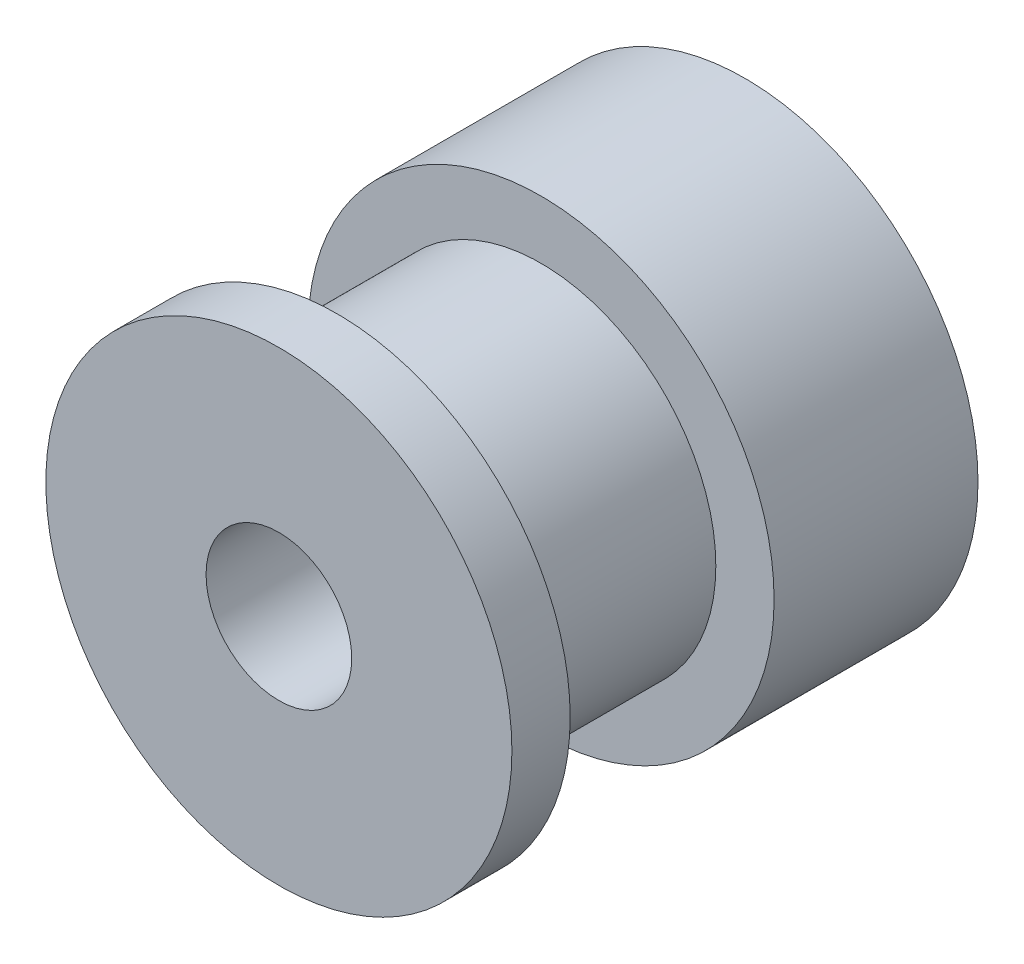
ISO-10303-21;
HEADER;
FILE_DESCRIPTION(('STEP AP214'),'2;1');
FILE_NAME('part.step','',(''),(''),'','','');
FILE_SCHEMA(('AUTOMOTIVE_DESIGN { 1 0 10303 214 1 1 1 1 }'));
ENDSEC;
DATA;
#1=APPLICATION_CONTEXT('core data for automotive mechanical design processes');
#2=APPLICATION_PROTOCOL_DEFINITION('international standard','automotive_design',2000,#1);
#3=PRODUCT_CONTEXT('',#1,'mechanical');
#4=PRODUCT('Part','Part','',(#3));
#5=PRODUCT_RELATED_PRODUCT_CATEGORY('part','',(#4));
#6=PRODUCT_DEFINITION_FORMATION('','',#4);
#7=PRODUCT_DEFINITION_CONTEXT('part definition',#1,'design');
#8=PRODUCT_DEFINITION('design','',#6,#7);
#9=PRODUCT_DEFINITION_SHAPE('','',#8);
#10=(LENGTH_UNIT() NAMED_UNIT(*) SI_UNIT(.MILLI.,.METRE.));
#11=(NAMED_UNIT(*) PLANE_ANGLE_UNIT() SI_UNIT($,.RADIAN.));
#12=(NAMED_UNIT(*) SI_UNIT($,.STERADIAN.) SOLID_ANGLE_UNIT());
#13=UNCERTAINTY_MEASURE_WITH_UNIT(LENGTH_MEASURE(1.E-05),#10,'distance_accuracy_value','');
#14=(GEOMETRIC_REPRESENTATION_CONTEXT(3) GLOBAL_UNCERTAINTY_ASSIGNED_CONTEXT((#13)) GLOBAL_UNIT_ASSIGNED_CONTEXT((#10,
#11,#12)) REPRESENTATION_CONTEXT('',''));
#15=CARTESIAN_POINT('',(0.,0.,0.));
#16=DIRECTION('',(0.,0.,1.));
#17=DIRECTION('',(1.,0.,0.));
#18=AXIS2_PLACEMENT_3D('',#15,#16,#17);
#19=CARTESIAN_POINT('',(0.,0.,7.));
#20=DIRECTION('',(0.,0.,-1.));
#21=DIRECTION('',(-1.,0.,0.));
#22=AXIS2_PLACEMENT_3D('',#19,#20,#21);
#23=CYLINDRICAL_SURFACE('',#22,8.);
#24=CARTESIAN_POINT('',(0.,0.,7.));
#25=DIRECTION('',(0.,0.,1.));
#26=DIRECTION('',(1.,0.,0.));
#27=AXIS2_PLACEMENT_3D('',#24,#25,#26);
#28=CIRCLE('',#27,8.);
#29=CARTESIAN_POINT('',(8.,0.,7.));
#30=VERTEX_POINT('',#29);
#31=EDGE_CURVE('E49',#30,#30,#28,.T.);
#32=ORIENTED_EDGE('',*,*,#31,.F.);
#33=EDGE_LOOP('',(#32));
#34=FACE_BOUND('',#33,.T.);
#35=CARTESIAN_POINT('',(0.,0.,0.));
#36=DIRECTION('',(0.,0.,1.));
#37=DIRECTION('',(1.,0.,0.));
#38=AXIS2_PLACEMENT_3D('',#35,#36,#37);
#39=CIRCLE('',#38,8.);
#40=CARTESIAN_POINT('',(8.,0.,0.));
#41=VERTEX_POINT('',#40);
#42=EDGE_CURVE('E44',#41,#41,#39,.T.);
#43=ORIENTED_EDGE('',*,*,#42,.T.);
#44=EDGE_LOOP('',(#43));
#45=FACE_BOUND('',#44,.T.);
#46=ADVANCED_FACE('F41',(#34,#45),#23,.T.);
#47=CARTESIAN_POINT('',(0.,0.,7.));
#48=DIRECTION('',(0.,0.,1.));
#49=DIRECTION('',(1.,0.,0.));
#50=AXIS2_PLACEMENT_3D('',#47,#48,#49);
#51=PLANE('',#50);
#52=CARTESIAN_POINT('',(0.,0.,7.));
#53=DIRECTION('',(0.,0.,1.));
#54=DIRECTION('',(1.,0.,0.));
#55=AXIS2_PLACEMENT_3D('',#52,#53,#54);
#56=CIRCLE('',#55,6.);
#57=CARTESIAN_POINT('',(6.,0.,7.));
#58=VERTEX_POINT('',#57);
#59=EDGE_CURVE('E10',#58,#58,#56,.T.);
#60=ORIENTED_EDGE('',*,*,#59,.F.);
#61=EDGE_LOOP('',(#60));
#62=FACE_BOUND('',#61,.T.);
#63=ORIENTED_EDGE('',*,*,#31,.T.);
#64=EDGE_LOOP('',(#63));
#65=FACE_BOUND('',#64,.T.);
#66=ADVANCED_FACE('F84',(#62,#65),#51,.T.);
#67=CARTESIAN_POINT('',(0.,0.,0.));
#68=DIRECTION('',(0.,0.,1.));
#69=DIRECTION('',(1.,0.,0.));
#70=AXIS2_PLACEMENT_3D('',#67,#68,#69);
#71=PLANE('',#70);
#72=CARTESIAN_POINT('',(0.,0.,0.));
#73=DIRECTION('',(0.,0.,-1.));
#74=DIRECTION('',(-1.,0.,0.));
#75=AXIS2_PLACEMENT_3D('',#72,#73,#74);
#76=CIRCLE('',#75,2.5);
#77=CARTESIAN_POINT('',(-2.5,0.,0.));
#78=VERTEX_POINT('',#77);
#79=EDGE_CURVE('E72',#78,#78,#76,.T.);
#80=ORIENTED_EDGE('',*,*,#79,.F.);
#81=EDGE_LOOP('',(#80));
#82=FACE_BOUND('',#81,.T.);
#83=ORIENTED_EDGE('',*,*,#42,.F.);
#84=EDGE_LOOP('',(#83));
#85=FACE_BOUND('',#84,.T.);
#86=ADVANCED_FACE('F80',(#82,#85),#71,.F.);
#87=CARTESIAN_POINT('',(0.,0.,14.));
#88=DIRECTION('',(0.,0.,-1.));
#89=DIRECTION('',(-1.,0.,0.));
#90=AXIS2_PLACEMENT_3D('',#87,#88,#89);
#91=CYLINDRICAL_SURFACE('',#90,6.);
#92=CARTESIAN_POINT('',(0.,0.,14.));
#93=DIRECTION('',(0.,0.,1.));
#94=DIRECTION('',(1.,0.,0.));
#95=AXIS2_PLACEMENT_3D('',#92,#93,#94);
#96=CIRCLE('',#95,6.);
#97=CARTESIAN_POINT('',(6.,0.,14.));
#98=VERTEX_POINT('',#97);
#99=EDGE_CURVE('E56',#98,#98,#96,.T.);
#100=ORIENTED_EDGE('',*,*,#99,.F.);
#101=EDGE_LOOP('',(#100));
#102=FACE_BOUND('',#101,.T.);
#103=ORIENTED_EDGE('',*,*,#59,.T.);
#104=EDGE_LOOP('',(#103));
#105=FACE_BOUND('',#104,.T.);
#106=ADVANCED_FACE('F83',(#102,#105),#91,.T.);
#107=CARTESIAN_POINT('',(0.,0.,16.));
#108=DIRECTION('',(0.,0.,-1.));
#109=DIRECTION('',(-1.,0.,0.));
#110=AXIS2_PLACEMENT_3D('',#107,#108,#109);
#111=CYLINDRICAL_SURFACE('',#110,8.);
#112=CARTESIAN_POINT('',(0.,0.,16.));
#113=DIRECTION('',(0.,0.,1.));
#114=DIRECTION('',(1.,0.,0.));
#115=AXIS2_PLACEMENT_3D('',#112,#113,#114);
#116=CIRCLE('',#115,8.);
#117=CARTESIAN_POINT('',(8.,0.,16.));
#118=VERTEX_POINT('',#117);
#119=EDGE_CURVE('E60',#118,#118,#116,.T.);
#120=ORIENTED_EDGE('',*,*,#119,.F.);
#121=EDGE_LOOP('',(#120));
#122=FACE_BOUND('',#121,.T.);
#123=CARTESIAN_POINT('',(0.,0.,14.));
#124=DIRECTION('',(0.,0.,1.));
#125=DIRECTION('',(1.,0.,0.));
#126=AXIS2_PLACEMENT_3D('',#123,#124,#125);
#127=CIRCLE('',#126,8.);
#128=CARTESIAN_POINT('',(8.,0.,14.));
#129=VERTEX_POINT('',#128);
#130=EDGE_CURVE('E61',#129,#129,#127,.T.);
#131=ORIENTED_EDGE('',*,*,#130,.T.);
#132=EDGE_LOOP('',(#131));
#133=FACE_BOUND('',#132,.T.);
#134=ADVANCED_FACE('F103',(#122,#133),#111,.T.);
#135=CARTESIAN_POINT('',(0.,0.,16.));
#136=DIRECTION('',(0.,0.,1.));
#137=DIRECTION('',(1.,0.,0.));
#138=AXIS2_PLACEMENT_3D('',#135,#136,#137);
#139=PLANE('',#138);
#140=CARTESIAN_POINT('',(0.,0.,16.));
#141=DIRECTION('',(0.,0.,1.));
#142=DIRECTION('',(1.,0.,0.));
#143=AXIS2_PLACEMENT_3D('',#140,#141,#142);
#144=CIRCLE('',#143,2.5);
#145=CARTESIAN_POINT('',(2.5,0.,16.));
#146=VERTEX_POINT('',#145);
#147=EDGE_CURVE('E65',#146,#146,#144,.F.);
#148=ORIENTED_EDGE('',*,*,#147,.T.);
#149=EDGE_LOOP('',(#148));
#150=FACE_BOUND('',#149,.T.);
#151=ORIENTED_EDGE('',*,*,#119,.T.);
#152=EDGE_LOOP('',(#151));
#153=FACE_BOUND('',#152,.T.);
#154=ADVANCED_FACE('F107',(#150,#153),#139,.T.);
#155=CARTESIAN_POINT('',(0.,0.,14.));
#156=DIRECTION('',(0.,0.,1.));
#157=DIRECTION('',(1.,0.,0.));
#158=AXIS2_PLACEMENT_3D('',#155,#156,#157);
#159=PLANE('',#158);
#160=ORIENTED_EDGE('',*,*,#99,.T.);
#161=EDGE_LOOP('',(#160));
#162=FACE_BOUND('',#161,.T.);
#163=ORIENTED_EDGE('',*,*,#130,.F.);
#164=EDGE_LOOP('',(#163));
#165=FACE_BOUND('',#164,.T.);
#166=ADVANCED_FACE('F109',(#162,#165),#159,.F.);
#167=CARTESIAN_POINT('',(0.,0.,23.0710678118655));
#168=DIRECTION('',(0.,0.,-1.));
#169=DIRECTION('',(-1.,0.,0.));
#170=AXIS2_PLACEMENT_3D('',#167,#168,#169);
#171=CYLINDRICAL_SURFACE('',#170,2.5);
#172=ORIENTED_EDGE('',*,*,#79,.T.);
#173=EDGE_LOOP('',(#172));
#174=FACE_BOUND('',#173,.T.);
#175=ORIENTED_EDGE('',*,*,#147,.F.);
#176=EDGE_LOOP('',(#175));
#177=FACE_BOUND('',#176,.T.);
#178=ADVANCED_FACE('F77',(#174,#177),#171,.F.);
#179=CLOSED_SHELL('',(#46,#66,#86,#106,#134,#154,#166,#178));
#180=MANIFOLD_SOLID_BREP('B2',#179);
#181=ADVANCED_BREP_SHAPE_REPRESENTATION('',(#18,#180),#14);
#182=SHAPE_DEFINITION_REPRESENTATION(#9,#181);
ENDSEC;
END-ISO-10303-21;
